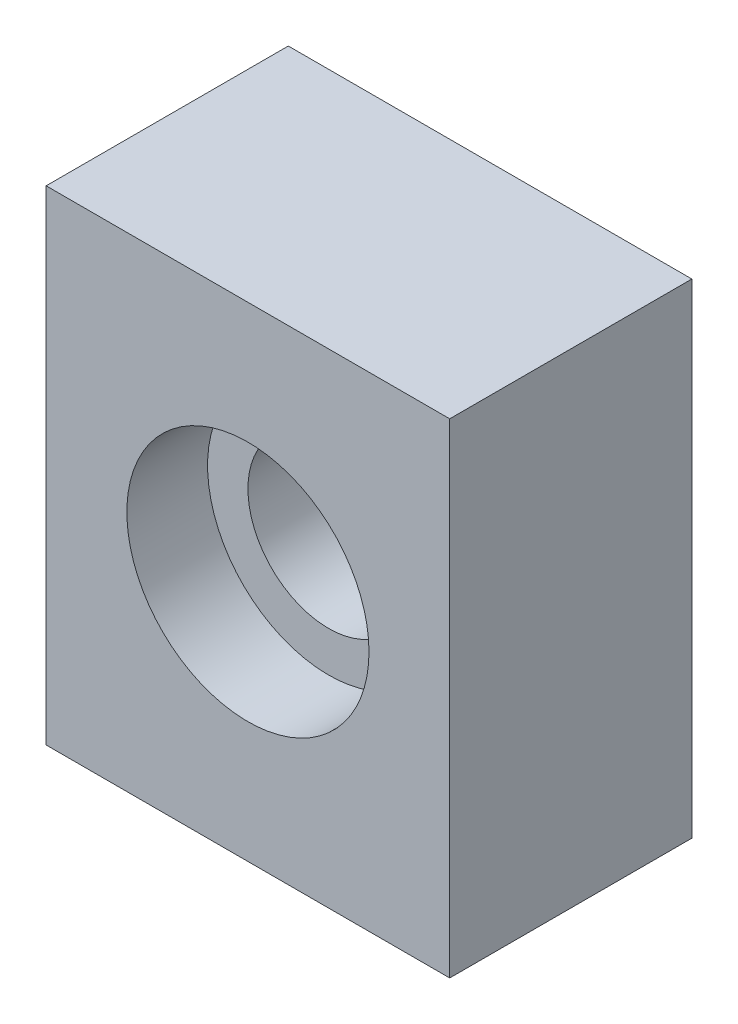
ISO-10303-21;
HEADER;
FILE_DESCRIPTION(('STEP AP214'),'2;1');
FILE_NAME('part.step','',(''),(''),'','','');
FILE_SCHEMA(('AUTOMOTIVE_DESIGN { 1 0 10303 214 1 1 1 1 }'));
ENDSEC;
DATA;
#1=APPLICATION_CONTEXT('core data for automotive mechanical design processes');
#2=APPLICATION_PROTOCOL_DEFINITION('international standard','automotive_design',2000,#1);
#3=PRODUCT_CONTEXT('',#1,'mechanical');
#4=PRODUCT('Part','Part','',(#3));
#5=PRODUCT_RELATED_PRODUCT_CATEGORY('part','',(#4));
#6=PRODUCT_DEFINITION_FORMATION('','',#4);
#7=PRODUCT_DEFINITION_CONTEXT('part definition',#1,'design');
#8=PRODUCT_DEFINITION('design','',#6,#7);
#9=PRODUCT_DEFINITION_SHAPE('','',#8);
#10=(LENGTH_UNIT() NAMED_UNIT(*) SI_UNIT(.MILLI.,.METRE.));
#11=(NAMED_UNIT(*) PLANE_ANGLE_UNIT() SI_UNIT($,.RADIAN.));
#12=(NAMED_UNIT(*) SI_UNIT($,.STERADIAN.) SOLID_ANGLE_UNIT());
#13=UNCERTAINTY_MEASURE_WITH_UNIT(LENGTH_MEASURE(1.E-05),#10,'distance_accuracy_value','');
#14=(GEOMETRIC_REPRESENTATION_CONTEXT(3) GLOBAL_UNCERTAINTY_ASSIGNED_CONTEXT((#13)) GLOBAL_UNIT_ASSIGNED_CONTEXT((#10,
#11,#12)) REPRESENTATION_CONTEXT('',''));
#15=CARTESIAN_POINT('',(0.,0.,0.));
#16=DIRECTION('',(0.,0.,1.));
#17=DIRECTION('',(1.,0.,0.));
#18=AXIS2_PLACEMENT_3D('',#15,#16,#17);
#19=CARTESIAN_POINT('',(0.,0.,30.));
#20=DIRECTION('',(0.,0.,-1.));
#21=DIRECTION('',(-1.,0.,0.));
#22=AXIS2_PLACEMENT_3D('',#19,#20,#21);
#23=CYLINDRICAL_SURFACE('',#22,10.);
#24=CARTESIAN_POINT('',(0.,0.,0.));
#25=DIRECTION('',(0.,0.,1.));
#26=DIRECTION('',(1.,0.,0.));
#27=AXIS2_PLACEMENT_3D('',#24,#25,#26);
#28=CIRCLE('',#27,10.);
#29=CARTESIAN_POINT('',(10.,0.,0.));
#30=VERTEX_POINT('',#29);
#31=EDGE_CURVE('E101',#30,#30,#28,.T.);
#32=ORIENTED_EDGE('',*,*,#31,.F.);
#33=EDGE_LOOP('',(#32));
#34=FACE_BOUND('',#33,.T.);
#35=CARTESIAN_POINT('',(0.,0.,20.));
#36=DIRECTION('',(0.,0.,1.));
#37=DIRECTION('',(1.,0.,0.));
#38=AXIS2_PLACEMENT_3D('',#35,#36,#37);
#39=CIRCLE('',#38,10.);
#40=CARTESIAN_POINT('',(10.,0.,20.));
#41=VERTEX_POINT('',#40);
#42=EDGE_CURVE('E36',#41,#41,#39,.T.);
#43=ORIENTED_EDGE('',*,*,#42,.T.);
#44=EDGE_LOOP('',(#43));
#45=FACE_BOUND('',#44,.T.);
#46=ADVANCED_FACE('F32',(#34,#45),#23,.F.);
#47=CARTESIAN_POINT('',(0.,0.,30.));
#48=DIRECTION('',(0.,0.,1.));
#49=DIRECTION('',(1.,0.,0.));
#50=AXIS2_PLACEMENT_3D('',#47,#48,#49);
#51=PLANE('',#50);
#52=CARTESIAN_POINT('',(0.,0.,30.));
#53=DIRECTION('',(0.,0.,1.));
#54=DIRECTION('',(1.,0.,0.));
#55=AXIS2_PLACEMENT_3D('',#52,#53,#54);
#56=CIRCLE('',#55,15.);
#57=CARTESIAN_POINT('',(15.,0.,30.));
#58=VERTEX_POINT('',#57);
#59=EDGE_CURVE('E115',#58,#58,#56,.T.);
#60=ORIENTED_EDGE('',*,*,#59,.F.);
#61=EDGE_LOOP('',(#60));
#62=FACE_BOUND('',#61,.T.);
#63=DIRECTION('',(0.,-1.,0.));
#64=VECTOR('',#63,1.);
#65=CARTESIAN_POINT('',(-25.,30.,30.));
#66=LINE('',#65,#64);
#67=CARTESIAN_POINT('',(-25.,30.,30.));
#68=VERTEX_POINT('',#67);
#69=CARTESIAN_POINT('',(-25.,-30.,30.));
#70=VERTEX_POINT('',#69);
#71=EDGE_CURVE('E85',#68,#70,#66,.T.);
#72=ORIENTED_EDGE('',*,*,#71,.T.);
#73=DIRECTION('',(1.,0.,0.));
#74=VECTOR('',#73,1.);
#75=CARTESIAN_POINT('',(-25.,-30.,30.));
#76=LINE('',#75,#74);
#77=CARTESIAN_POINT('',(25.,-30.,30.));
#78=VERTEX_POINT('',#77);
#79=EDGE_CURVE('E80',#70,#78,#76,.T.);
#80=ORIENTED_EDGE('',*,*,#79,.T.);
#81=DIRECTION('',(0.,1.,0.));
#82=VECTOR('',#81,1.);
#83=CARTESIAN_POINT('',(25.,30.,30.));
#84=LINE('',#83,#82);
#85=CARTESIAN_POINT('',(25.,30.,30.));
#86=VERTEX_POINT('',#85);
#87=EDGE_CURVE('E83',#78,#86,#84,.T.);
#88=ORIENTED_EDGE('',*,*,#87,.T.);
#89=DIRECTION('',(-1.,0.,0.));
#90=VECTOR('',#89,1.);
#91=CARTESIAN_POINT('',(-25.,30.,30.));
#92=LINE('',#91,#90);
#93=EDGE_CURVE('E50',#86,#68,#92,.T.);
#94=ORIENTED_EDGE('',*,*,#93,.T.);
#95=EDGE_LOOP('',(#72,#80,#88,#94));
#96=FACE_BOUND('',#95,.T.);
#97=ADVANCED_FACE('F81',(#62,#96),#51,.T.);
#98=CARTESIAN_POINT('',(0.,0.,0.));
#99=DIRECTION('',(0.,0.,1.));
#100=DIRECTION('',(1.,0.,0.));
#101=AXIS2_PLACEMENT_3D('',#98,#99,#100);
#102=PLANE('',#101);
#103=DIRECTION('',(0.,-1.,0.));
#104=VECTOR('',#103,1.);
#105=CARTESIAN_POINT('',(-25.,30.,0.));
#106=LINE('',#105,#104);
#107=CARTESIAN_POINT('',(-25.,30.,0.));
#108=VERTEX_POINT('',#107);
#109=CARTESIAN_POINT('',(-25.,-30.,0.));
#110=VERTEX_POINT('',#109);
#111=EDGE_CURVE('E98',#108,#110,#106,.T.);
#112=ORIENTED_EDGE('',*,*,#111,.F.);
#113=DIRECTION('',(-1.,0.,0.));
#114=VECTOR('',#113,1.);
#115=CARTESIAN_POINT('',(-25.,30.,0.));
#116=LINE('',#115,#114);
#117=CARTESIAN_POINT('',(25.,30.,0.));
#118=VERTEX_POINT('',#117);
#119=EDGE_CURVE('E73',#118,#108,#116,.T.);
#120=ORIENTED_EDGE('',*,*,#119,.F.);
#121=DIRECTION('',(0.,1.,0.));
#122=VECTOR('',#121,1.);
#123=CARTESIAN_POINT('',(25.,30.,0.));
#124=LINE('',#123,#122);
#125=CARTESIAN_POINT('',(25.,-30.,0.));
#126=VERTEX_POINT('',#125);
#127=EDGE_CURVE('E67',#126,#118,#124,.T.);
#128=ORIENTED_EDGE('',*,*,#127,.F.);
#129=DIRECTION('',(1.,0.,0.));
#130=VECTOR('',#129,1.);
#131=CARTESIAN_POINT('',(-25.,-30.,0.));
#132=LINE('',#131,#130);
#133=EDGE_CURVE('E89',#110,#126,#132,.T.);
#134=ORIENTED_EDGE('',*,*,#133,.F.);
#135=EDGE_LOOP('',(#112,#120,#128,#134));
#136=FACE_BOUND('',#135,.T.);
#137=ORIENTED_EDGE('',*,*,#31,.T.);
#138=EDGE_LOOP('',(#137));
#139=FACE_BOUND('',#138,.T.);
#140=ADVANCED_FACE('F109',(#136,#139),#102,.F.);
#141=CARTESIAN_POINT('',(-25.,30.,30.));
#142=DIRECTION('',(1.,0.,0.));
#143=DIRECTION('',(0.,1.,0.));
#144=AXIS2_PLACEMENT_3D('',#141,#142,#143);
#145=PLANE('',#144);
#146=ORIENTED_EDGE('',*,*,#111,.T.);
#147=DIRECTION('',(0.,0.,-1.));
#148=VECTOR('',#147,1.);
#149=CARTESIAN_POINT('',(-25.,-30.,30.));
#150=LINE('',#149,#148);
#151=EDGE_CURVE('E11',#70,#110,#150,.T.);
#152=ORIENTED_EDGE('',*,*,#151,.F.);
#153=ORIENTED_EDGE('',*,*,#71,.F.);
#154=DIRECTION('',(0.,0.,-1.));
#155=VECTOR('',#154,1.);
#156=CARTESIAN_POINT('',(-25.,30.,30.));
#157=LINE('',#156,#155);
#158=EDGE_CURVE('E94',#68,#108,#157,.T.);
#159=ORIENTED_EDGE('',*,*,#158,.T.);
#160=EDGE_LOOP('',(#146,#152,#153,#159));
#161=FACE_BOUND('',#160,.T.);
#162=ADVANCED_FACE('F34',(#161),#145,.F.);
#163=CARTESIAN_POINT('',(-25.,-30.,30.));
#164=DIRECTION('',(0.,1.,0.));
#165=DIRECTION('',(0.,0.,1.));
#166=AXIS2_PLACEMENT_3D('',#163,#164,#165);
#167=PLANE('',#166);
#168=ORIENTED_EDGE('',*,*,#133,.T.);
#169=DIRECTION('',(0.,0.,-1.));
#170=VECTOR('',#169,1.);
#171=CARTESIAN_POINT('',(25.,-30.,30.));
#172=LINE('',#171,#170);
#173=EDGE_CURVE('E42',#78,#126,#172,.T.);
#174=ORIENTED_EDGE('',*,*,#173,.F.);
#175=ORIENTED_EDGE('',*,*,#79,.F.);
#176=ORIENTED_EDGE('',*,*,#151,.T.);
#177=EDGE_LOOP('',(#168,#174,#175,#176));
#178=FACE_BOUND('',#177,.T.);
#179=ADVANCED_FACE('F88',(#178),#167,.F.);
#180=CARTESIAN_POINT('',(25.,30.,30.));
#181=DIRECTION('',(-1.,0.,0.));
#182=DIRECTION('',(0.,-1.,0.));
#183=AXIS2_PLACEMENT_3D('',#180,#181,#182);
#184=PLANE('',#183);
#185=ORIENTED_EDGE('',*,*,#127,.T.);
#186=DIRECTION('',(0.,0.,-1.));
#187=VECTOR('',#186,1.);
#188=CARTESIAN_POINT('',(25.,30.,30.));
#189=LINE('',#188,#187);
#190=EDGE_CURVE('E90',#86,#118,#189,.T.);
#191=ORIENTED_EDGE('',*,*,#190,.F.);
#192=ORIENTED_EDGE('',*,*,#87,.F.);
#193=ORIENTED_EDGE('',*,*,#173,.T.);
#194=EDGE_LOOP('',(#185,#191,#192,#193));
#195=FACE_BOUND('',#194,.T.);
#196=ADVANCED_FACE('F92',(#195),#184,.F.);
#197=CARTESIAN_POINT('',(-25.,30.,30.));
#198=DIRECTION('',(0.,-1.,0.));
#199=DIRECTION('',(0.,0.,-1.));
#200=AXIS2_PLACEMENT_3D('',#197,#198,#199);
#201=PLANE('',#200);
#202=ORIENTED_EDGE('',*,*,#119,.T.);
#203=ORIENTED_EDGE('',*,*,#158,.F.);
#204=ORIENTED_EDGE('',*,*,#93,.F.);
#205=ORIENTED_EDGE('',*,*,#190,.T.);
#206=EDGE_LOOP('',(#202,#203,#204,#205));
#207=FACE_BOUND('',#206,.T.);
#208=ADVANCED_FACE('F106',(#207),#201,.F.);
#209=CARTESIAN_POINT('',(0.,0.,20.));
#210=DIRECTION('',(0.,0.,1.));
#211=DIRECTION('',(1.,0.,0.));
#212=AXIS2_PLACEMENT_3D('',#209,#210,#211);
#213=CYLINDRICAL_SURFACE('',#212,15.);
#214=CARTESIAN_POINT('',(0.,0.,20.));
#215=DIRECTION('',(0.,0.,1.));
#216=DIRECTION('',(1.,0.,0.));
#217=AXIS2_PLACEMENT_3D('',#214,#215,#216);
#218=CIRCLE('',#217,15.);
#219=CARTESIAN_POINT('',(15.,0.,20.));
#220=VERTEX_POINT('',#219);
#221=EDGE_CURVE('E118',#220,#220,#218,.T.);
#222=ORIENTED_EDGE('',*,*,#221,.F.);
#223=EDGE_LOOP('',(#222));
#224=FACE_BOUND('',#223,.T.);
#225=ORIENTED_EDGE('',*,*,#59,.T.);
#226=EDGE_LOOP('',(#225));
#227=FACE_BOUND('',#226,.T.);
#228=ADVANCED_FACE('F128',(#224,#227),#213,.F.);
#229=CARTESIAN_POINT('',(0.,0.,20.));
#230=DIRECTION('',(0.,0.,1.));
#231=DIRECTION('',(1.,0.,0.));
#232=AXIS2_PLACEMENT_3D('',#229,#230,#231);
#233=PLANE('',#232);
#234=ORIENTED_EDGE('',*,*,#42,.F.);
#235=EDGE_LOOP('',(#234));
#236=FACE_BOUND('',#235,.T.);
#237=ORIENTED_EDGE('',*,*,#221,.T.);
#238=EDGE_LOOP('',(#237));
#239=FACE_BOUND('',#238,.T.);
#240=ADVANCED_FACE('F126',(#236,#239),#233,.T.);
#241=CLOSED_SHELL('',(#46,#97,#140,#162,#179,#196,#208,#228,#240));
#242=MANIFOLD_SOLID_BREP('B2',#241);
#243=ADVANCED_BREP_SHAPE_REPRESENTATION('',(#18,#242),#14);
#244=SHAPE_DEFINITION_REPRESENTATION(#9,#243);
ENDSEC;
END-ISO-10303-21;
